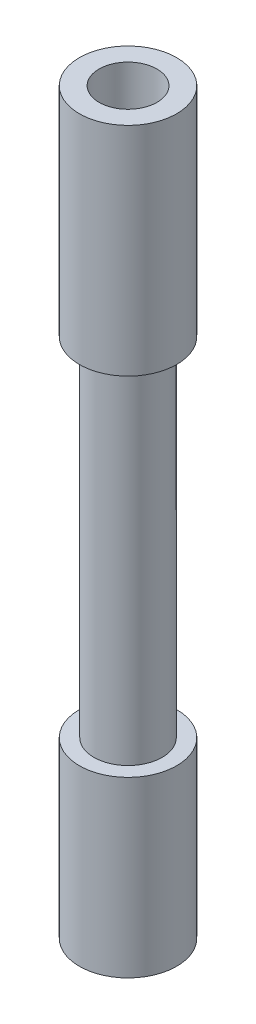
ISO-10303-21;
HEADER;
FILE_DESCRIPTION(('STEP AP214'),'2;1');
FILE_NAME('part.step','',(''),(''),'','','');
FILE_SCHEMA(('AUTOMOTIVE_DESIGN { 1 0 10303 214 1 1 1 1 }'));
ENDSEC;
DATA;
#1=APPLICATION_CONTEXT('core data for automotive mechanical design processes');
#2=APPLICATION_PROTOCOL_DEFINITION('international standard','automotive_design',2000,#1);
#3=PRODUCT_CONTEXT('',#1,'mechanical');
#4=PRODUCT('Part','Part','',(#3));
#5=PRODUCT_RELATED_PRODUCT_CATEGORY('part','',(#4));
#6=PRODUCT_DEFINITION_FORMATION('','',#4);
#7=PRODUCT_DEFINITION_CONTEXT('part definition',#1,'design');
#8=PRODUCT_DEFINITION('design','',#6,#7);
#9=PRODUCT_DEFINITION_SHAPE('','',#8);
#10=(LENGTH_UNIT() NAMED_UNIT(*) SI_UNIT(.MILLI.,.METRE.));
#11=(NAMED_UNIT(*) PLANE_ANGLE_UNIT() SI_UNIT($,.RADIAN.));
#12=(NAMED_UNIT(*) SI_UNIT($,.STERADIAN.) SOLID_ANGLE_UNIT());
#13=UNCERTAINTY_MEASURE_WITH_UNIT(LENGTH_MEASURE(1.E-05),#10,'distance_accuracy_value','');
#14=(GEOMETRIC_REPRESENTATION_CONTEXT(3) GLOBAL_UNCERTAINTY_ASSIGNED_CONTEXT((#13)) GLOBAL_UNIT_ASSIGNED_CONTEXT((#10,
#11,#12)) REPRESENTATION_CONTEXT('',''));
#15=CARTESIAN_POINT('',(0.,0.,0.));
#16=DIRECTION('',(0.,0.,1.));
#17=DIRECTION('',(1.,0.,0.));
#18=AXIS2_PLACEMENT_3D('',#15,#16,#17);
#19=CARTESIAN_POINT('',(0.,0.,0.));
#20=DIRECTION('',(0.,-1.,0.));
#21=DIRECTION('',(0.,0.,-1.));
#22=AXIS2_PLACEMENT_3D('',#19,#20,#21);
#23=CYLINDRICAL_SURFACE('',#22,5.334);
#24=CARTESIAN_POINT('',(0.,9.525,0.));
#25=DIRECTION('',(0.,-1.,0.));
#26=DIRECTION('',(0.,0.,-1.));
#27=AXIS2_PLACEMENT_3D('',#24,#25,#26);
#28=CIRCLE('',#27,5.334);
#29=CARTESIAN_POINT('',(0.,9.525,-5.334));
#30=VERTEX_POINT('',#29);
#31=EDGE_CURVE('E38',#30,#30,#28,.T.);
#32=ORIENTED_EDGE('',*,*,#31,.T.);
#33=EDGE_LOOP('',(#32));
#34=FACE_BOUND('',#33,.T.);
#35=CARTESIAN_POINT('',(0.,-14.2875,0.));
#36=DIRECTION('',(0.,-1.,0.));
#37=DIRECTION('',(0.,0.,-1.));
#38=AXIS2_PLACEMENT_3D('',#35,#36,#37);
#39=CIRCLE('',#38,5.334);
#40=CARTESIAN_POINT('',(0.,-14.2875,-5.334));
#41=VERTEX_POINT('',#40);
#42=EDGE_CURVE('E57',#41,#41,#39,.T.);
#43=ORIENTED_EDGE('',*,*,#42,.F.);
#44=EDGE_LOOP('',(#43));
#45=FACE_BOUND('',#44,.T.);
#46=ADVANCED_FACE('F31',(#34,#45),#23,.T.);
#47=CARTESIAN_POINT('',(0.,0.,0.));
#48=DIRECTION('',(0.,-1.,0.));
#49=DIRECTION('',(0.,0.,-1.));
#50=AXIS2_PLACEMENT_3D('',#47,#48,#49);
#51=CYLINDRICAL_SURFACE('',#50,3.175);
#52=CARTESIAN_POINT('',(0.,0.,0.));
#53=DIRECTION('',(0.,-1.,0.));
#54=DIRECTION('',(0.,0.,-1.));
#55=AXIS2_PLACEMENT_3D('',#52,#53,#54);
#56=CIRCLE('',#55,3.175);
#57=CARTESIAN_POINT('',(0.,0.,-3.175));
#58=VERTEX_POINT('',#57);
#59=EDGE_CURVE('E46',#58,#58,#56,.T.);
#60=ORIENTED_EDGE('',*,*,#59,.T.);
#61=EDGE_LOOP('',(#60));
#62=FACE_BOUND('',#61,.T.);
#63=CARTESIAN_POINT('',(0.,9.525,0.));
#64=DIRECTION('',(0.,-1.,0.));
#65=DIRECTION('',(0.,0.,-1.));
#66=AXIS2_PLACEMENT_3D('',#63,#64,#65);
#67=CIRCLE('',#66,3.175);
#68=CARTESIAN_POINT('',(0.,9.525,-3.175));
#69=VERTEX_POINT('',#68);
#70=EDGE_CURVE('E10',#69,#69,#67,.T.);
#71=ORIENTED_EDGE('',*,*,#70,.F.);
#72=EDGE_LOOP('',(#71));
#73=FACE_BOUND('',#72,.T.);
#74=ADVANCED_FACE('F33',(#62,#73),#51,.F.);
#75=CARTESIAN_POINT('',(3.175,9.525,0.));
#76=DIRECTION('',(0.,1.,0.));
#77=DIRECTION('',(0.,0.,1.));
#78=AXIS2_PLACEMENT_3D('',#75,#76,#77);
#79=PLANE('',#78);
#80=ORIENTED_EDGE('',*,*,#70,.T.);
#81=EDGE_LOOP('',(#80));
#82=FACE_BOUND('',#81,.T.);
#83=ORIENTED_EDGE('',*,*,#31,.F.);
#84=EDGE_LOOP('',(#83));
#85=FACE_BOUND('',#84,.T.);
#86=ADVANCED_FACE('F89',(#82,#85),#79,.T.);
#87=CARTESIAN_POINT('',(0.,-52.3875,0.));
#88=DIRECTION('',(0.,-1.,0.));
#89=DIRECTION('',(0.,0.,-1.));
#90=AXIS2_PLACEMENT_3D('',#87,#88,#89);
#91=CIRCLE('',#90,5.334);
#92=CARTESIAN_POINT('',(0.,-52.3875,-5.334));
#93=VERTEX_POINT('',#92);
#94=EDGE_CURVE('E58',#93,#93,#91,.T.);
#95=ORIENTED_EDGE('',*,*,#94,.T.);
#96=EDGE_LOOP('',(#95));
#97=FACE_BOUND('',#96,.T.);
#98=CARTESIAN_POINT('',(0.,-71.4375,0.));
#99=DIRECTION('',(0.,-1.,0.));
#100=DIRECTION('',(0.,0.,-1.));
#101=AXIS2_PLACEMENT_3D('',#98,#99,#100);
#102=CIRCLE('',#101,5.334);
#103=CARTESIAN_POINT('',(0.,-71.4375,-5.334));
#104=VERTEX_POINT('',#103);
#105=EDGE_CURVE('E51',#104,#104,#102,.T.);
#106=ORIENTED_EDGE('',*,*,#105,.F.);
#107=EDGE_LOOP('',(#106));
#108=FACE_BOUND('',#107,.T.);
#109=ADVANCED_FACE('F83',(#97,#108),#23,.T.);
#110=CARTESIAN_POINT('',(0.,0.,0.));
#111=DIRECTION('',(0.,-1.,0.));
#112=DIRECTION('',(0.,0.,-1.));
#113=AXIS2_PLACEMENT_3D('',#110,#111,#112);
#114=CYLINDRICAL_SURFACE('',#113,2.);
#115=CARTESIAN_POINT('',(0.,0.,0.));
#116=DIRECTION('',(0.,-1.,0.));
#117=DIRECTION('',(0.,0.,-1.));
#118=AXIS2_PLACEMENT_3D('',#115,#116,#117);
#119=CIRCLE('',#118,2.);
#120=CARTESIAN_POINT('',(0.,0.,-2.));
#121=VERTEX_POINT('',#120);
#122=EDGE_CURVE('E42',#121,#121,#119,.T.);
#123=ORIENTED_EDGE('',*,*,#122,.F.);
#124=EDGE_LOOP('',(#123));
#125=FACE_BOUND('',#124,.T.);
#126=CARTESIAN_POINT('',(0.,-71.4375,0.));
#127=DIRECTION('',(0.,-1.,0.));
#128=DIRECTION('',(0.,0.,-1.));
#129=AXIS2_PLACEMENT_3D('',#126,#127,#128);
#130=CIRCLE('',#129,2.);
#131=CARTESIAN_POINT('',(0.,-71.4375,-2.));
#132=VERTEX_POINT('',#131);
#133=EDGE_CURVE('E54',#132,#132,#130,.T.);
#134=ORIENTED_EDGE('',*,*,#133,.T.);
#135=EDGE_LOOP('',(#134));
#136=FACE_BOUND('',#135,.T.);
#137=ADVANCED_FACE('F92',(#125,#136),#114,.F.);
#138=CARTESIAN_POINT('',(2.,0.,0.));
#139=DIRECTION('',(0.,1.,0.));
#140=DIRECTION('',(0.,0.,1.));
#141=AXIS2_PLACEMENT_3D('',#138,#139,#140);
#142=PLANE('',#141);
#143=ORIENTED_EDGE('',*,*,#122,.T.);
#144=EDGE_LOOP('',(#143));
#145=FACE_BOUND('',#144,.T.);
#146=ORIENTED_EDGE('',*,*,#59,.F.);
#147=EDGE_LOOP('',(#146));
#148=FACE_BOUND('',#147,.T.);
#149=ADVANCED_FACE('F98',(#145,#148),#142,.T.);
#150=CARTESIAN_POINT('',(0.,-71.4375,0.));
#151=DIRECTION('',(0.,-1.,0.));
#152=DIRECTION('',(0.,0.,-1.));
#153=AXIS2_PLACEMENT_3D('',#150,#151,#152);
#154=PLANE('',#153);
#155=ORIENTED_EDGE('',*,*,#105,.T.);
#156=EDGE_LOOP('',(#155));
#157=FACE_BOUND('',#156,.T.);
#158=ORIENTED_EDGE('',*,*,#133,.F.);
#159=EDGE_LOOP('',(#158));
#160=FACE_BOUND('',#159,.T.);
#161=ADVANCED_FACE('F77',(#157,#160),#154,.T.);
#162=CARTESIAN_POINT('',(0.,-14.2875,0.));
#163=DIRECTION('',(0.,-1.,0.));
#164=DIRECTION('',(0.,0.,-1.));
#165=AXIS2_PLACEMENT_3D('',#162,#163,#164);
#166=PLANE('',#165);
#167=CARTESIAN_POINT('',(0.,-14.2875,0.));
#168=DIRECTION('',(0.,-1.,0.));
#169=DIRECTION('',(0.,0.,-1.));
#170=AXIS2_PLACEMENT_3D('',#167,#168,#169);
#171=CIRCLE('',#170,3.7465);
#172=CARTESIAN_POINT('',(0.,-14.2875,-3.7465));
#173=VERTEX_POINT('',#172);
#174=EDGE_CURVE('E61',#173,#173,#171,.T.);
#175=ORIENTED_EDGE('',*,*,#174,.F.);
#176=EDGE_LOOP('',(#175));
#177=FACE_BOUND('',#176,.T.);
#178=ORIENTED_EDGE('',*,*,#42,.T.);
#179=EDGE_LOOP('',(#178));
#180=FACE_BOUND('',#179,.T.);
#181=ADVANCED_FACE('F73',(#177,#180),#166,.T.);
#182=CARTESIAN_POINT('',(0.,-52.3875,0.));
#183=DIRECTION('',(0.,-1.,0.));
#184=DIRECTION('',(0.,0.,-1.));
#185=AXIS2_PLACEMENT_3D('',#182,#183,#184);
#186=PLANE('',#185);
#187=CARTESIAN_POINT('',(0.,-52.3875,0.));
#188=DIRECTION('',(0.,-1.,0.));
#189=DIRECTION('',(0.,0.,-1.));
#190=AXIS2_PLACEMENT_3D('',#187,#188,#189);
#191=CIRCLE('',#190,3.7465);
#192=CARTESIAN_POINT('',(0.,-52.3875,-3.7465));
#193=VERTEX_POINT('',#192);
#194=EDGE_CURVE('E64',#193,#193,#191,.T.);
#195=ORIENTED_EDGE('',*,*,#194,.T.);
#196=EDGE_LOOP('',(#195));
#197=FACE_BOUND('',#196,.T.);
#198=ORIENTED_EDGE('',*,*,#94,.F.);
#199=EDGE_LOOP('',(#198));
#200=FACE_BOUND('',#199,.T.);
#201=ADVANCED_FACE('F76',(#197,#200),#186,.F.);
#202=CARTESIAN_POINT('',(0.,-14.2875,0.));
#203=DIRECTION('',(0.,-1.,0.));
#204=DIRECTION('',(0.,0.,-1.));
#205=AXIS2_PLACEMENT_3D('',#202,#203,#204);
#206=CYLINDRICAL_SURFACE('',#205,3.7465);
#207=CARTESIAN_POINT('',(0.,-14.2875,-3.7465));
#208=CARTESIAN_POINT('',(0.,-14.684375,-3.7465));
#209=CARTESIAN_POINT('',(0.,-15.08125,-3.7465));
#210=CARTESIAN_POINT('',(0.,-15.875,-3.7465));
#211=CARTESIAN_POINT('',(0.,-16.271875,-3.7465));
#212=CARTESIAN_POINT('',(0.,-17.065625,-3.7465));
#213=CARTESIAN_POINT('',(0.,-17.4625,-3.7465));
#214=CARTESIAN_POINT('',(0.,-18.25625,-3.7465));
#215=CARTESIAN_POINT('',(0.,-18.653125,-3.7465));
#216=CARTESIAN_POINT('',(0.,-19.446875,-3.7465));
#217=CARTESIAN_POINT('',(0.,-19.84375,-3.7465));
#218=CARTESIAN_POINT('',(0.,-20.6375,-3.7465));
#219=CARTESIAN_POINT('',(0.,-21.034375,-3.7465));
#220=CARTESIAN_POINT('',(0.,-21.828125,-3.7465));
#221=CARTESIAN_POINT('',(0.,-22.225,-3.7465));
#222=CARTESIAN_POINT('',(0.,-23.01875,-3.7465));
#223=CARTESIAN_POINT('',(0.,-23.415625,-3.7465));
#224=CARTESIAN_POINT('',(0.,-24.209375,-3.7465));
#225=CARTESIAN_POINT('',(0.,-24.60625,-3.7465));
#226=CARTESIAN_POINT('',(0.,-25.4,-3.7465));
#227=CARTESIAN_POINT('',(0.,-25.796875,-3.7465));
#228=CARTESIAN_POINT('',(0.,-26.590625,-3.7465));
#229=CARTESIAN_POINT('',(0.,-26.9875,-3.7465));
#230=CARTESIAN_POINT('',(0.,-27.78125,-3.7465));
#231=CARTESIAN_POINT('',(0.,-28.178125,-3.7465));
#232=CARTESIAN_POINT('',(0.,-28.971875,-3.7465));
#233=CARTESIAN_POINT('',(0.,-29.36875,-3.7465));
#234=CARTESIAN_POINT('',(0.,-30.1625,-3.7465));
#235=CARTESIAN_POINT('',(0.,-30.559375,-3.7465));
#236=CARTESIAN_POINT('',(0.,-31.353125,-3.7465));
#237=CARTESIAN_POINT('',(0.,-31.75,-3.7465));
#238=CARTESIAN_POINT('',(0.,-32.54375,-3.7465));
#239=CARTESIAN_POINT('',(0.,-32.940625,-3.7465));
#240=CARTESIAN_POINT('',(0.,-33.734375,-3.7465));
#241=CARTESIAN_POINT('',(0.,-34.13125,-3.7465));
#242=CARTESIAN_POINT('',(0.,-34.925,-3.7465));
#243=CARTESIAN_POINT('',(0.,-35.321875,-3.7465));
#244=CARTESIAN_POINT('',(0.,-36.115625,-3.7465));
#245=CARTESIAN_POINT('',(0.,-36.5125,-3.7465));
#246=CARTESIAN_POINT('',(0.,-37.30625,-3.7465));
#247=CARTESIAN_POINT('',(0.,-37.703125,-3.7465));
#248=CARTESIAN_POINT('',(0.,-38.496875,-3.7465));
#249=CARTESIAN_POINT('',(0.,-38.89375,-3.7465));
#250=CARTESIAN_POINT('',(0.,-39.6875,-3.7465));
#251=CARTESIAN_POINT('',(0.,-40.084375,-3.7465));
#252=CARTESIAN_POINT('',(0.,-40.878125,-3.7465));
#253=CARTESIAN_POINT('',(0.,-41.275,-3.7465));
#254=CARTESIAN_POINT('',(0.,-42.06875,-3.7465));
#255=CARTESIAN_POINT('',(0.,-42.465625,-3.7465));
#256=CARTESIAN_POINT('',(0.,-43.259375,-3.7465));
#257=CARTESIAN_POINT('',(0.,-43.65625,-3.7465));
#258=CARTESIAN_POINT('',(0.,-44.45,-3.7465));
#259=CARTESIAN_POINT('',(0.,-44.846875,-3.7465));
#260=CARTESIAN_POINT('',(0.,-45.640625,-3.7465));
#261=CARTESIAN_POINT('',(0.,-46.0375,-3.7465));
#262=CARTESIAN_POINT('',(0.,-46.83125,-3.7465));
#263=CARTESIAN_POINT('',(0.,-47.228125,-3.7465));
#264=CARTESIAN_POINT('',(0.,-48.021875,-3.7465));
#265=CARTESIAN_POINT('',(0.,-48.41875,-3.7465));
#266=CARTESIAN_POINT('',(0.,-49.2125,-3.7465));
#267=CARTESIAN_POINT('',(0.,-49.609375,-3.7465));
#268=CARTESIAN_POINT('',(0.,-50.403125,-3.7465));
#269=CARTESIAN_POINT('',(0.,-50.8,-3.7465));
#270=CARTESIAN_POINT('',(0.,-51.59375,-3.7465));
#271=CARTESIAN_POINT('',(0.,-51.990625,-3.7465));
#272=CARTESIAN_POINT('',(0.,-52.3875,-3.7465));
#273=B_SPLINE_CURVE_WITH_KNOTS('',3,(#207,#208,#209,#210,#211,#212,#213,#214,#215,#216,#217,
#218,#219,#220,#221,#222,#223,#224,#225,#226,#227,#228,#229,#230,#231,#232,#233,#234,#235,#236,
#237,#238,#239,#240,#241,#242,#243,#244,#245,#246,#247,#248,#249,#250,#251,#252,#253,#254,#255,
#256,#257,#258,#259,#260,#261,#262,#263,#264,#265,#266,#267,#268,#269,#270,#271,#272),
.UNSPECIFIED.,.F.,.F.,(4,2,2,2,2,2,2,2,2,2,2,2,2,2,2,2,2,2,2,2,2,2,2,2,2,2,2,2,2,2,2,2,4),(0.,
1.190625,2.38125,3.571875,4.7625,5.953125,7.14375,8.334375,9.525,10.715625,11.90625,13.096875,
14.2875,15.478125,16.66875,17.859375,19.05,20.240625,21.43125,22.621875,23.8125,25.003125,
26.19375,27.384375,28.575,29.765625,30.95625,32.146875,33.3375,34.528125,35.71875,36.909375,
38.1),.UNSPECIFIED.);
#274=EDGE_CURVE('BSEAM70',#173,#193,#273,.T.);
#275=ORIENTED_EDGE('',*,*,#174,.T.);
#276=ORIENTED_EDGE('',*,*,#194,.F.);
#277=ORIENTED_EDGE('',*,*,#274,.T.);
#278=ORIENTED_EDGE('',*,*,#274,.F.);
#279=EDGE_LOOP('',(#275,#277,#276,#278));
#280=FACE_BOUND('',#279,.T.);
#281=ADVANCED_FACE('F70',(#280),#206,.T.);
#282=CLOSED_SHELL('',(#46,#74,#86,#109,#137,#149,#161,#181,#201,#281));
#283=MANIFOLD_SOLID_BREP('B2',#282);
#284=ADVANCED_BREP_SHAPE_REPRESENTATION('',(#18,#283),#14);
#285=SHAPE_DEFINITION_REPRESENTATION(#9,#284);
ENDSEC;
END-ISO-10303-21;
